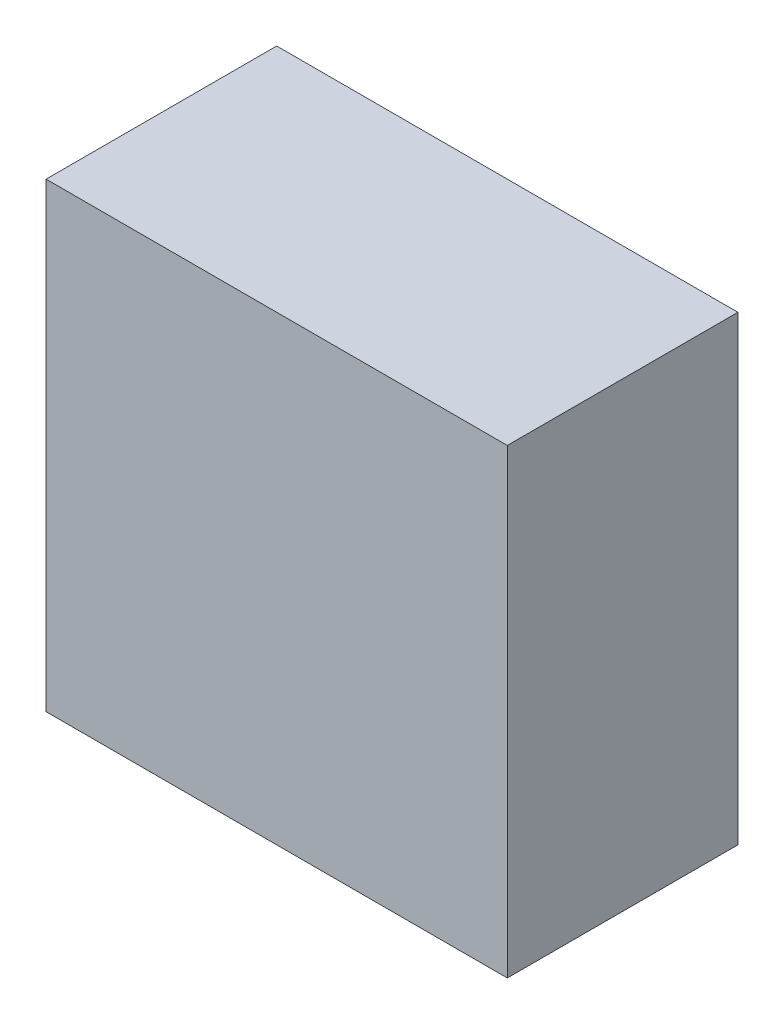
ISO-10303-21;
HEADER;
FILE_DESCRIPTION(('STEP AP214'),'2;1');
FILE_NAME('part.step','',(''),(''),'','','');
FILE_SCHEMA(('AUTOMOTIVE_DESIGN { 1 0 10303 214 1 1 1 1 }'));
ENDSEC;
DATA;
#1=APPLICATION_CONTEXT('core data for automotive mechanical design processes');
#2=APPLICATION_PROTOCOL_DEFINITION('international standard','automotive_design',2000,#1);
#3=PRODUCT_CONTEXT('',#1,'mechanical');
#4=PRODUCT('Part','Part','',(#3));
#5=PRODUCT_RELATED_PRODUCT_CATEGORY('part','',(#4));
#6=PRODUCT_DEFINITION_FORMATION('','',#4);
#7=PRODUCT_DEFINITION_CONTEXT('part definition',#1,'design');
#8=PRODUCT_DEFINITION('design','',#6,#7);
#9=PRODUCT_DEFINITION_SHAPE('','',#8);
#10=(LENGTH_UNIT() NAMED_UNIT(*) SI_UNIT(.MILLI.,.METRE.));
#11=(NAMED_UNIT(*) PLANE_ANGLE_UNIT() SI_UNIT($,.RADIAN.));
#12=(NAMED_UNIT(*) SI_UNIT($,.STERADIAN.) SOLID_ANGLE_UNIT());
#13=UNCERTAINTY_MEASURE_WITH_UNIT(LENGTH_MEASURE(1.E-05),#10,'distance_accuracy_value','');
#14=(GEOMETRIC_REPRESENTATION_CONTEXT(3) GLOBAL_UNCERTAINTY_ASSIGNED_CONTEXT((#13)) GLOBAL_UNIT_ASSIGNED_CONTEXT((#10,
#11,#12)) REPRESENTATION_CONTEXT('',''));
#15=CARTESIAN_POINT('',(0.,0.,0.));
#16=DIRECTION('',(0.,0.,1.));
#17=DIRECTION('',(1.,0.,0.));
#18=AXIS2_PLACEMENT_3D('',#15,#16,#17);
#19=CARTESIAN_POINT('',(1.,1.,1.));
#20=DIRECTION('',(-1.,0.,0.));
#21=DIRECTION('',(0.,0.,1.));
#22=AXIS2_PLACEMENT_3D('',#19,#20,#21);
#23=PLANE('',#22);
#24=DIRECTION('',(0.,1.,0.));
#25=VECTOR('',#24,1.);
#26=CARTESIAN_POINT('',(1.,1.,0.));
#27=LINE('',#26,#25);
#28=CARTESIAN_POINT('',(1.,-1.,0.));
#29=VERTEX_POINT('',#28);
#30=CARTESIAN_POINT('',(1.,1.,0.));
#31=VERTEX_POINT('',#30);
#32=EDGE_CURVE('E95',#29,#31,#27,.T.);
#33=ORIENTED_EDGE('',*,*,#32,.T.);
#34=DIRECTION('',(0.,0.,-1.));
#35=VECTOR('',#34,1.);
#36=CARTESIAN_POINT('',(1.,1.,1.));
#37=LINE('',#36,#35);
#38=CARTESIAN_POINT('',(1.,1.,1.));
#39=VERTEX_POINT('',#38);
#40=EDGE_CURVE('E11',#39,#31,#37,.T.);
#41=ORIENTED_EDGE('',*,*,#40,.F.);
#42=DIRECTION('',(0.,1.,0.));
#43=VECTOR('',#42,1.);
#44=CARTESIAN_POINT('',(1.,1.,1.));
#45=LINE('',#44,#43);
#46=CARTESIAN_POINT('',(1.,-1.,1.));
#47=VERTEX_POINT('',#46);
#48=EDGE_CURVE('E83',#47,#39,#45,.T.);
#49=ORIENTED_EDGE('',*,*,#48,.F.);
#50=DIRECTION('',(0.,0.,-1.));
#51=VECTOR('',#50,1.);
#52=CARTESIAN_POINT('',(1.,-1.,1.));
#53=LINE('',#52,#51);
#54=EDGE_CURVE('E91',#47,#29,#53,.T.);
#55=ORIENTED_EDGE('',*,*,#54,.T.);
#56=EDGE_LOOP('',(#33,#41,#49,#55));
#57=FACE_BOUND('',#56,.T.);
#58=ADVANCED_FACE('F32',(#57),#23,.F.);
#59=CARTESIAN_POINT('',(-1.,1.,1.));
#60=DIRECTION('',(0.,-1.,0.));
#61=DIRECTION('',(0.,0.,-1.));
#62=AXIS2_PLACEMENT_3D('',#59,#60,#61);
#63=PLANE('',#62);
#64=DIRECTION('',(-1.,0.,0.));
#65=VECTOR('',#64,1.);
#66=CARTESIAN_POINT('',(-1.,1.,0.));
#67=LINE('',#66,#65);
#68=CARTESIAN_POINT('',(-1.,1.,0.));
#69=VERTEX_POINT('',#68);
#70=EDGE_CURVE('E87',#31,#69,#67,.T.);
#71=ORIENTED_EDGE('',*,*,#70,.T.);
#72=DIRECTION('',(0.,0.,-1.));
#73=VECTOR('',#72,1.);
#74=CARTESIAN_POINT('',(-1.,1.,1.));
#75=LINE('',#74,#73);
#76=CARTESIAN_POINT('',(-1.,1.,1.));
#77=VERTEX_POINT('',#76);
#78=EDGE_CURVE('E40',#77,#69,#75,.T.);
#79=ORIENTED_EDGE('',*,*,#78,.F.);
#80=DIRECTION('',(-1.,0.,0.));
#81=VECTOR('',#80,1.);
#82=CARTESIAN_POINT('',(-1.,1.,1.));
#83=LINE('',#82,#81);
#84=EDGE_CURVE('E78',#39,#77,#83,.T.);
#85=ORIENTED_EDGE('',*,*,#84,.F.);
#86=ORIENTED_EDGE('',*,*,#40,.T.);
#87=EDGE_LOOP('',(#71,#79,#85,#86));
#88=FACE_BOUND('',#87,.T.);
#89=ADVANCED_FACE('F86',(#88),#63,.F.);
#90=CARTESIAN_POINT('',(-1.,-1.,1.));
#91=DIRECTION('',(1.,0.,0.));
#92=DIRECTION('',(0.,0.,-1.));
#93=AXIS2_PLACEMENT_3D('',#90,#91,#92);
#94=PLANE('',#93);
#95=DIRECTION('',(0.,-1.,0.));
#96=VECTOR('',#95,1.);
#97=CARTESIAN_POINT('',(-1.,-1.,0.));
#98=LINE('',#97,#96);
#99=CARTESIAN_POINT('',(-1.,-1.,0.));
#100=VERTEX_POINT('',#99);
#101=EDGE_CURVE('E65',#69,#100,#98,.T.);
#102=ORIENTED_EDGE('',*,*,#101,.T.);
#103=DIRECTION('',(0.,0.,-1.));
#104=VECTOR('',#103,1.);
#105=CARTESIAN_POINT('',(-1.,-1.,1.));
#106=LINE('',#105,#104);
#107=CARTESIAN_POINT('',(-1.,-1.,1.));
#108=VERTEX_POINT('',#107);
#109=EDGE_CURVE('E88',#108,#100,#106,.T.);
#110=ORIENTED_EDGE('',*,*,#109,.F.);
#111=DIRECTION('',(0.,-1.,0.));
#112=VECTOR('',#111,1.);
#113=CARTESIAN_POINT('',(-1.,-1.,1.));
#114=LINE('',#113,#112);
#115=EDGE_CURVE('E81',#77,#108,#114,.T.);
#116=ORIENTED_EDGE('',*,*,#115,.F.);
#117=ORIENTED_EDGE('',*,*,#78,.T.);
#118=EDGE_LOOP('',(#102,#110,#116,#117));
#119=FACE_BOUND('',#118,.T.);
#120=ADVANCED_FACE('F89',(#119),#94,.F.);
#121=CARTESIAN_POINT('',(1.,-1.,1.));
#122=DIRECTION('',(0.,1.,0.));
#123=DIRECTION('',(0.,0.,1.));
#124=AXIS2_PLACEMENT_3D('',#121,#122,#123);
#125=PLANE('',#124);
#126=DIRECTION('',(1.,0.,0.));
#127=VECTOR('',#126,1.);
#128=CARTESIAN_POINT('',(1.,-1.,0.));
#129=LINE('',#128,#127);
#130=EDGE_CURVE('E71',#100,#29,#129,.T.);
#131=ORIENTED_EDGE('',*,*,#130,.T.);
#132=ORIENTED_EDGE('',*,*,#54,.F.);
#133=DIRECTION('',(1.,0.,0.));
#134=VECTOR('',#133,1.);
#135=CARTESIAN_POINT('',(1.,-1.,1.));
#136=LINE('',#135,#134);
#137=EDGE_CURVE('E48',#108,#47,#136,.T.);
#138=ORIENTED_EDGE('',*,*,#137,.F.);
#139=ORIENTED_EDGE('',*,*,#109,.T.);
#140=EDGE_LOOP('',(#131,#132,#138,#139));
#141=FACE_BOUND('',#140,.T.);
#142=ADVANCED_FACE('F102',(#141),#125,.F.);
#143=CARTESIAN_POINT('',(0.,0.,1.));
#144=DIRECTION('',(0.,0.,-1.));
#145=DIRECTION('',(-1.,0.,0.));
#146=AXIS2_PLACEMENT_3D('',#143,#144,#145);
#147=PLANE('',#146);
#148=ORIENTED_EDGE('',*,*,#48,.T.);
#149=ORIENTED_EDGE('',*,*,#84,.T.);
#150=ORIENTED_EDGE('',*,*,#115,.T.);
#151=ORIENTED_EDGE('',*,*,#137,.T.);
#152=EDGE_LOOP('',(#148,#149,#150,#151));
#153=FACE_BOUND('',#152,.T.);
#154=ADVANCED_FACE('F79',(#153),#147,.F.);
#155=CARTESIAN_POINT('',(0.,0.,0.));
#156=DIRECTION('',(0.,0.,-1.));
#157=DIRECTION('',(-1.,0.,0.));
#158=AXIS2_PLACEMENT_3D('',#155,#156,#157);
#159=PLANE('',#158);
#160=ORIENTED_EDGE('',*,*,#32,.F.);
#161=ORIENTED_EDGE('',*,*,#130,.F.);
#162=ORIENTED_EDGE('',*,*,#101,.F.);
#163=ORIENTED_EDGE('',*,*,#70,.F.);
#164=EDGE_LOOP('',(#160,#161,#162,#163));
#165=FACE_BOUND('',#164,.T.);
#166=ADVANCED_FACE('F105',(#165),#159,.T.);
#167=CLOSED_SHELL('',(#58,#89,#120,#142,#154,#166));
#168=MANIFOLD_SOLID_BREP('B2',#167);
#169=ADVANCED_BREP_SHAPE_REPRESENTATION('',(#18,#168),#14);
#170=SHAPE_DEFINITION_REPRESENTATION(#9,#169);
ENDSEC;
END-ISO-10303-21;
